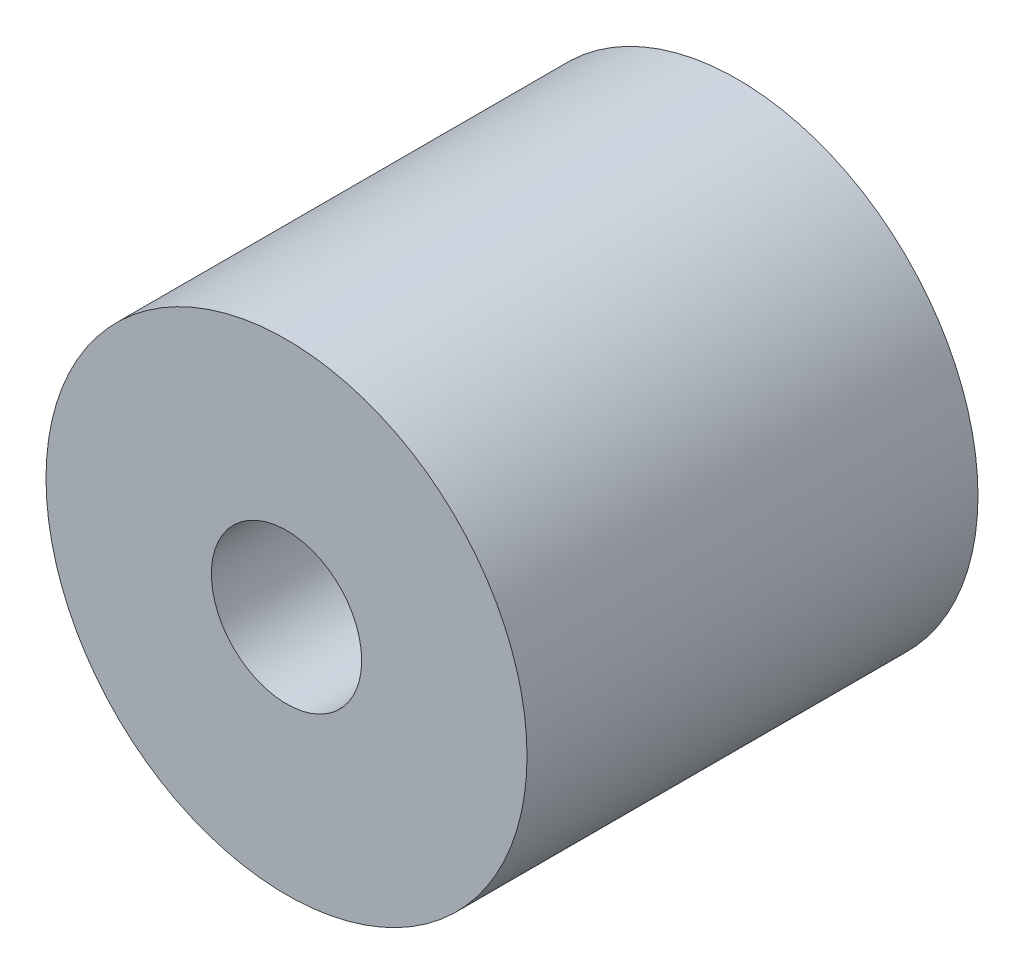
ISO-10303-21;
HEADER;
FILE_DESCRIPTION(('STEP AP214'),'2;1');
FILE_NAME('part.step','',(''),(''),'','','');
FILE_SCHEMA(('AUTOMOTIVE_DESIGN { 1 0 10303 214 1 1 1 1 }'));
ENDSEC;
DATA;
#1=APPLICATION_CONTEXT('core data for automotive mechanical design processes');
#2=APPLICATION_PROTOCOL_DEFINITION('international standard','automotive_design',2000,#1);
#3=PRODUCT_CONTEXT('',#1,'mechanical');
#4=PRODUCT('Part','Part','',(#3));
#5=PRODUCT_RELATED_PRODUCT_CATEGORY('part','',(#4));
#6=PRODUCT_DEFINITION_FORMATION('','',#4);
#7=PRODUCT_DEFINITION_CONTEXT('part definition',#1,'design');
#8=PRODUCT_DEFINITION('design','',#6,#7);
#9=PRODUCT_DEFINITION_SHAPE('','',#8);
#10=(LENGTH_UNIT() NAMED_UNIT(*) SI_UNIT(.MILLI.,.METRE.));
#11=(NAMED_UNIT(*) PLANE_ANGLE_UNIT() SI_UNIT($,.RADIAN.));
#12=(NAMED_UNIT(*) SI_UNIT($,.STERADIAN.) SOLID_ANGLE_UNIT());
#13=UNCERTAINTY_MEASURE_WITH_UNIT(LENGTH_MEASURE(1.E-05),#10,'distance_accuracy_value','');
#14=(GEOMETRIC_REPRESENTATION_CONTEXT(3) GLOBAL_UNCERTAINTY_ASSIGNED_CONTEXT((#13)) GLOBAL_UNIT_ASSIGNED_CONTEXT((#10,
#11,#12)) REPRESENTATION_CONTEXT('',''));
#15=CARTESIAN_POINT('',(0.,0.,0.));
#16=DIRECTION('',(0.,0.,1.));
#17=DIRECTION('',(1.,0.,0.));
#18=AXIS2_PLACEMENT_3D('',#15,#16,#17);
#19=CARTESIAN_POINT('',(0.,0.,15.));
#20=DIRECTION('',(0.,0.,1.));
#21=DIRECTION('',(1.,0.,0.));
#22=AXIS2_PLACEMENT_3D('',#19,#20,#21);
#23=PLANE('',#22);
#24=CARTESIAN_POINT('',(0.,0.,15.));
#25=DIRECTION('',(0.,0.,1.));
#26=DIRECTION('',(1.,0.,0.));
#27=AXIS2_PLACEMENT_3D('',#24,#25,#26);
#28=CIRCLE('',#27,8.);
#29=CARTESIAN_POINT('',(8.,0.,15.));
#30=VERTEX_POINT('',#29);
#31=EDGE_CURVE('E10',#30,#30,#28,.T.);
#32=ORIENTED_EDGE('',*,*,#31,.T.);
#33=EDGE_LOOP('',(#32));
#34=FACE_BOUND('',#33,.T.);
#35=CARTESIAN_POINT('',(0.,0.,15.));
#36=DIRECTION('',(0.,0.,1.));
#37=DIRECTION('',(1.,0.,0.));
#38=AXIS2_PLACEMENT_3D('',#35,#36,#37);
#39=CIRCLE('',#38,2.5);
#40=CARTESIAN_POINT('',(2.5,0.,15.));
#41=VERTEX_POINT('',#40);
#42=EDGE_CURVE('E48',#41,#41,#39,.T.);
#43=ORIENTED_EDGE('',*,*,#42,.F.);
#44=EDGE_LOOP('',(#43));
#45=FACE_BOUND('',#44,.T.);
#46=ADVANCED_FACE('F37',(#34,#45),#23,.T.);
#47=CARTESIAN_POINT('',(0.,0.,0.));
#48=DIRECTION('',(0.,0.,1.));
#49=DIRECTION('',(1.,0.,0.));
#50=AXIS2_PLACEMENT_3D('',#47,#48,#49);
#51=PLANE('',#50);
#52=CARTESIAN_POINT('',(0.,0.,0.));
#53=DIRECTION('',(0.,0.,1.));
#54=DIRECTION('',(1.,0.,0.));
#55=AXIS2_PLACEMENT_3D('',#52,#53,#54);
#56=CIRCLE('',#55,8.);
#57=CARTESIAN_POINT('',(8.,0.,0.));
#58=VERTEX_POINT('',#57);
#59=EDGE_CURVE('E41',#58,#58,#56,.T.);
#60=ORIENTED_EDGE('',*,*,#59,.F.);
#61=EDGE_LOOP('',(#60));
#62=FACE_BOUND('',#61,.T.);
#63=CARTESIAN_POINT('',(0.,0.,0.));
#64=DIRECTION('',(0.,0.,1.));
#65=DIRECTION('',(1.,0.,0.));
#66=AXIS2_PLACEMENT_3D('',#63,#64,#65);
#67=CIRCLE('',#66,2.5);
#68=CARTESIAN_POINT('',(2.5,0.,0.));
#69=VERTEX_POINT('',#68);
#70=EDGE_CURVE('E50',#69,#69,#67,.T.);
#71=ORIENTED_EDGE('',*,*,#70,.T.);
#72=EDGE_LOOP('',(#71));
#73=FACE_BOUND('',#72,.T.);
#74=ADVANCED_FACE('F60',(#62,#73),#51,.F.);
#75=CARTESIAN_POINT('',(0.,0.,15.));
#76=DIRECTION('',(0.,0.,-1.));
#77=DIRECTION('',(-1.,0.,0.));
#78=AXIS2_PLACEMENT_3D('',#75,#76,#77);
#79=CYLINDRICAL_SURFACE('',#78,8.);
#80=ORIENTED_EDGE('',*,*,#31,.F.);
#81=EDGE_LOOP('',(#80));
#82=FACE_BOUND('',#81,.T.);
#83=ORIENTED_EDGE('',*,*,#59,.T.);
#84=EDGE_LOOP('',(#83));
#85=FACE_BOUND('',#84,.T.);
#86=ADVANCED_FACE('F39',(#82,#85),#79,.T.);
#87=CARTESIAN_POINT('',(0.,0.,15.));
#88=DIRECTION('',(0.,0.,-1.));
#89=DIRECTION('',(-1.,0.,0.));
#90=AXIS2_PLACEMENT_3D('',#87,#88,#89);
#91=CYLINDRICAL_SURFACE('',#90,2.5);
#92=ORIENTED_EDGE('',*,*,#42,.T.);
#93=EDGE_LOOP('',(#92));
#94=FACE_BOUND('',#93,.T.);
#95=ORIENTED_EDGE('',*,*,#70,.F.);
#96=EDGE_LOOP('',(#95));
#97=FACE_BOUND('',#96,.T.);
#98=ADVANCED_FACE('F56',(#94,#97),#91,.F.);
#99=CLOSED_SHELL('',(#46,#74,#86,#98));
#100=MANIFOLD_SOLID_BREP('B2',#99);
#101=ADVANCED_BREP_SHAPE_REPRESENTATION('',(#18,#100),#14);
#102=SHAPE_DEFINITION_REPRESENTATION(#9,#101);
ENDSEC;
END-ISO-10303-21;
